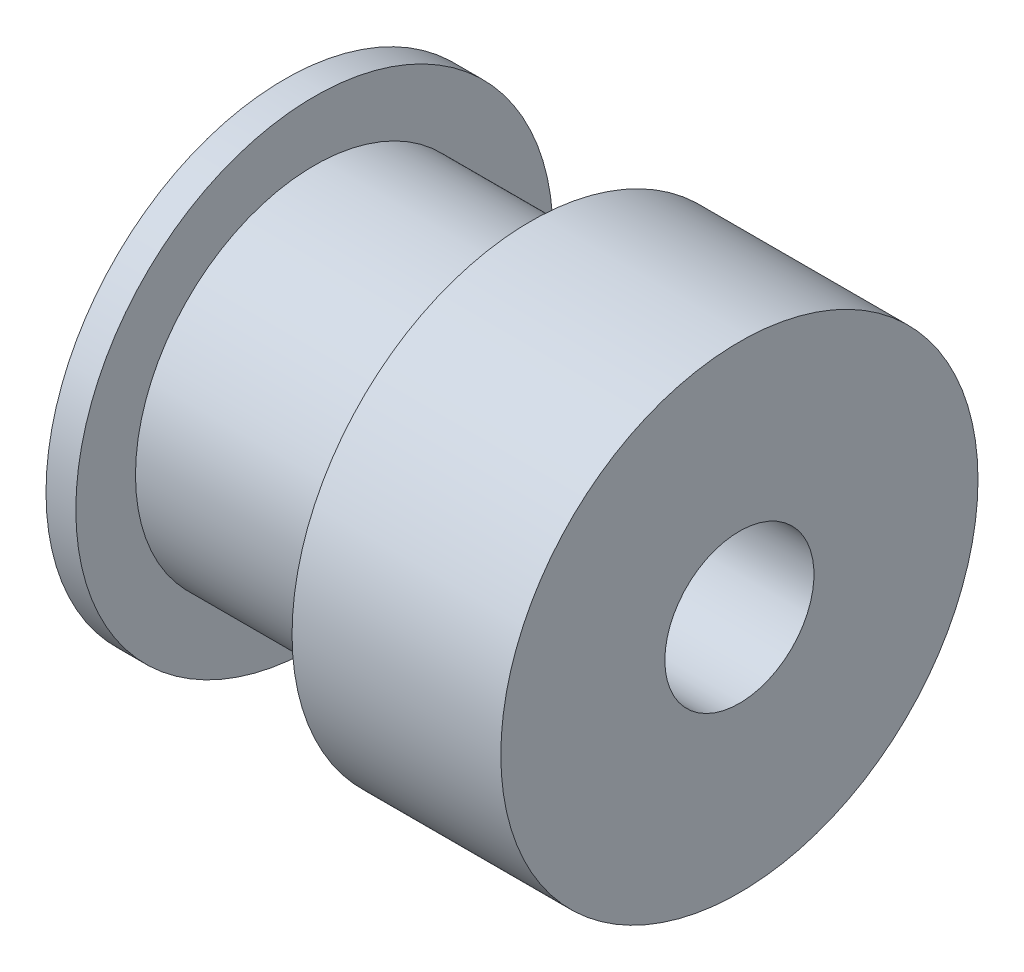
ISO-10303-21;
HEADER;
FILE_DESCRIPTION(('STEP AP214'),'2;1');
FILE_NAME('part.step','',(''),(''),'','','');
FILE_SCHEMA(('AUTOMOTIVE_DESIGN { 1 0 10303 214 1 1 1 1 }'));
ENDSEC;
DATA;
#1=APPLICATION_CONTEXT('core data for automotive mechanical design processes');
#2=APPLICATION_PROTOCOL_DEFINITION('international standard','automotive_design',2000,#1);
#3=PRODUCT_CONTEXT('',#1,'mechanical');
#4=PRODUCT('Part','Part','',(#3));
#5=PRODUCT_RELATED_PRODUCT_CATEGORY('part','',(#4));
#6=PRODUCT_DEFINITION_FORMATION('','',#4);
#7=PRODUCT_DEFINITION_CONTEXT('part definition',#1,'design');
#8=PRODUCT_DEFINITION('design','',#6,#7);
#9=PRODUCT_DEFINITION_SHAPE('','',#8);
#10=(LENGTH_UNIT() NAMED_UNIT(*) SI_UNIT(.MILLI.,.METRE.));
#11=(NAMED_UNIT(*) PLANE_ANGLE_UNIT() SI_UNIT($,.RADIAN.));
#12=(NAMED_UNIT(*) SI_UNIT($,.STERADIAN.) SOLID_ANGLE_UNIT());
#13=UNCERTAINTY_MEASURE_WITH_UNIT(LENGTH_MEASURE(1.E-05),#10,'distance_accuracy_value','');
#14=(GEOMETRIC_REPRESENTATION_CONTEXT(3) GLOBAL_UNCERTAINTY_ASSIGNED_CONTEXT((#13)) GLOBAL_UNIT_ASSIGNED_CONTEXT((#10,
#11,#12)) REPRESENTATION_CONTEXT('',''));
#15=CARTESIAN_POINT('',(0.,0.,0.));
#16=DIRECTION('',(0.,0.,1.));
#17=DIRECTION('',(1.,0.,0.));
#18=AXIS2_PLACEMENT_3D('',#15,#16,#17);
#19=CARTESIAN_POINT('',(-7.625,2.5,0.));
#20=DIRECTION('',(1.,0.,0.));
#21=DIRECTION('',(0.,0.,-1.));
#22=AXIS2_PLACEMENT_3D('',#19,#20,#21);
#23=PLANE('',#22);
#24=CARTESIAN_POINT('',(-7.625,0.,0.));
#25=DIRECTION('',(-1.,0.,0.));
#26=DIRECTION('',(0.,0.,1.));
#27=AXIS2_PLACEMENT_3D('',#24,#25,#26);
#28=CIRCLE('',#27,2.5);
#29=CARTESIAN_POINT('',(-7.625,0.,2.5));
#30=VERTEX_POINT('',#29);
#31=EDGE_CURVE('E63',#30,#30,#28,.T.);
#32=ORIENTED_EDGE('',*,*,#31,.F.);
#33=EDGE_LOOP('',(#32));
#34=FACE_BOUND('',#33,.T.);
#35=CARTESIAN_POINT('',(-7.625,0.,0.));
#36=DIRECTION('',(-1.,0.,0.));
#37=DIRECTION('',(0.,0.,1.));
#38=AXIS2_PLACEMENT_3D('',#35,#36,#37);
#39=CIRCLE('',#38,8.);
#40=CARTESIAN_POINT('',(-7.625,0.,8.));
#41=VERTEX_POINT('',#40);
#42=EDGE_CURVE('E10',#41,#41,#39,.T.);
#43=ORIENTED_EDGE('',*,*,#42,.T.);
#44=EDGE_LOOP('',(#43));
#45=FACE_BOUND('',#44,.T.);
#46=ADVANCED_FACE('F35',(#34,#45),#23,.F.);
#47=CARTESIAN_POINT('',(-7.625,0.,0.));
#48=DIRECTION('',(-1.,0.,0.));
#49=DIRECTION('',(0.,0.,1.));
#50=AXIS2_PLACEMENT_3D('',#47,#48,#49);
#51=CYLINDRICAL_SURFACE('',#50,8.);
#52=ORIENTED_EDGE('',*,*,#42,.F.);
#53=EDGE_LOOP('',(#52));
#54=FACE_BOUND('',#53,.T.);
#55=CARTESIAN_POINT('',(-6.625,0.,0.));
#56=DIRECTION('',(-1.,0.,0.));
#57=DIRECTION('',(0.,0.,1.));
#58=AXIS2_PLACEMENT_3D('',#55,#56,#57);
#59=CIRCLE('',#58,8.);
#60=CARTESIAN_POINT('',(-6.625,0.,8.));
#61=VERTEX_POINT('',#60);
#62=EDGE_CURVE('E41',#61,#61,#59,.T.);
#63=ORIENTED_EDGE('',*,*,#62,.T.);
#64=EDGE_LOOP('',(#63));
#65=FACE_BOUND('',#64,.T.);
#66=ADVANCED_FACE('F70',(#54,#65),#51,.T.);
#67=CARTESIAN_POINT('',(-6.625,8.,0.));
#68=DIRECTION('',(-1.,0.,0.));
#69=DIRECTION('',(0.,0.,1.));
#70=AXIS2_PLACEMENT_3D('',#67,#68,#69);
#71=PLANE('',#70);
#72=ORIENTED_EDGE('',*,*,#62,.F.);
#73=EDGE_LOOP('',(#72));
#74=FACE_BOUND('',#73,.T.);
#75=CARTESIAN_POINT('',(-6.625,0.,0.));
#76=DIRECTION('',(-1.,0.,0.));
#77=DIRECTION('',(0.,0.,1.));
#78=AXIS2_PLACEMENT_3D('',#75,#76,#77);
#79=CIRCLE('',#78,6.);
#80=CARTESIAN_POINT('',(-6.625,0.,6.));
#81=VERTEX_POINT('',#80);
#82=EDGE_CURVE('E45',#81,#81,#79,.T.);
#83=ORIENTED_EDGE('',*,*,#82,.T.);
#84=EDGE_LOOP('',(#83));
#85=FACE_BOUND('',#84,.T.);
#86=ADVANCED_FACE('F74',(#74,#85),#71,.F.);
#87=CARTESIAN_POINT('',(-7.625,0.,0.));
#88=DIRECTION('',(-1.,0.,0.));
#89=DIRECTION('',(0.,0.,1.));
#90=AXIS2_PLACEMENT_3D('',#87,#88,#89);
#91=CYLINDRICAL_SURFACE('',#90,6.);
#92=ORIENTED_EDGE('',*,*,#82,.F.);
#93=EDGE_LOOP('',(#92));
#94=FACE_BOUND('',#93,.T.);
#95=CARTESIAN_POINT('',(0.625000000000001,0.,0.));
#96=DIRECTION('',(-1.,0.,0.));
#97=DIRECTION('',(0.,0.,1.));
#98=AXIS2_PLACEMENT_3D('',#95,#96,#97);
#99=CIRCLE('',#98,6.);
#100=CARTESIAN_POINT('',(0.625000000000001,0.,6.));
#101=VERTEX_POINT('',#100);
#102=EDGE_CURVE('E49',#101,#101,#99,.T.);
#103=ORIENTED_EDGE('',*,*,#102,.T.);
#104=EDGE_LOOP('',(#103));
#105=FACE_BOUND('',#104,.T.);
#106=ADVANCED_FACE('F79',(#94,#105),#91,.T.);
#107=CARTESIAN_POINT('',(0.625,6.,0.));
#108=DIRECTION('',(1.,0.,0.));
#109=DIRECTION('',(0.,0.,-1.));
#110=AXIS2_PLACEMENT_3D('',#107,#108,#109);
#111=PLANE('',#110);
#112=ORIENTED_EDGE('',*,*,#102,.F.);
#113=EDGE_LOOP('',(#112));
#114=FACE_BOUND('',#113,.T.);
#115=CARTESIAN_POINT('',(0.625000000000001,0.,0.));
#116=DIRECTION('',(-1.,0.,0.));
#117=DIRECTION('',(0.,0.,1.));
#118=AXIS2_PLACEMENT_3D('',#115,#116,#117);
#119=CIRCLE('',#118,8.);
#120=CARTESIAN_POINT('',(0.625000000000001,0.,8.));
#121=VERTEX_POINT('',#120);
#122=EDGE_CURVE('E54',#121,#121,#119,.T.);
#123=ORIENTED_EDGE('',*,*,#122,.T.);
#124=EDGE_LOOP('',(#123));
#125=FACE_BOUND('',#124,.T.);
#126=ADVANCED_FACE('F85',(#114,#125),#111,.F.);
#127=CARTESIAN_POINT('',(-7.625,0.,0.));
#128=DIRECTION('',(-1.,0.,0.));
#129=DIRECTION('',(0.,0.,1.));
#130=AXIS2_PLACEMENT_3D('',#127,#128,#129);
#131=CYLINDRICAL_SURFACE('',#130,8.);
#132=ORIENTED_EDGE('',*,*,#122,.F.);
#133=EDGE_LOOP('',(#132));
#134=FACE_BOUND('',#133,.T.);
#135=CARTESIAN_POINT('',(7.625,0.,0.));
#136=DIRECTION('',(-1.,0.,0.));
#137=DIRECTION('',(0.,0.,1.));
#138=AXIS2_PLACEMENT_3D('',#135,#136,#137);
#139=CIRCLE('',#138,8.);
#140=CARTESIAN_POINT('',(7.625,0.,8.));
#141=VERTEX_POINT('',#140);
#142=EDGE_CURVE('E57',#141,#141,#139,.T.);
#143=ORIENTED_EDGE('',*,*,#142,.T.);
#144=EDGE_LOOP('',(#143));
#145=FACE_BOUND('',#144,.T.);
#146=ADVANCED_FACE('F89',(#134,#145),#131,.T.);
#147=CARTESIAN_POINT('',(7.625,8.,0.));
#148=DIRECTION('',(-1.,0.,0.));
#149=DIRECTION('',(0.,0.,1.));
#150=AXIS2_PLACEMENT_3D('',#147,#148,#149);
#151=PLANE('',#150);
#152=ORIENTED_EDGE('',*,*,#142,.F.);
#153=EDGE_LOOP('',(#152));
#154=FACE_BOUND('',#153,.T.);
#155=CARTESIAN_POINT('',(7.625,0.,0.));
#156=DIRECTION('',(-1.,0.,0.));
#157=DIRECTION('',(0.,0.,1.));
#158=AXIS2_PLACEMENT_3D('',#155,#156,#157);
#159=CIRCLE('',#158,2.5);
#160=CARTESIAN_POINT('',(7.625,0.,2.5));
#161=VERTEX_POINT('',#160);
#162=EDGE_CURVE('E60',#161,#161,#159,.T.);
#163=ORIENTED_EDGE('',*,*,#162,.T.);
#164=EDGE_LOOP('',(#163));
#165=FACE_BOUND('',#164,.T.);
#166=ADVANCED_FACE('F93',(#154,#165),#151,.F.);
#167=CARTESIAN_POINT('',(-7.625,0.,0.));
#168=DIRECTION('',(-1.,0.,0.));
#169=DIRECTION('',(0.,0.,1.));
#170=AXIS2_PLACEMENT_3D('',#167,#168,#169);
#171=CYLINDRICAL_SURFACE('',#170,2.5);
#172=ORIENTED_EDGE('',*,*,#162,.F.);
#173=EDGE_LOOP('',(#172));
#174=FACE_BOUND('',#173,.T.);
#175=ORIENTED_EDGE('',*,*,#31,.T.);
#176=EDGE_LOOP('',(#175));
#177=FACE_BOUND('',#176,.T.);
#178=ADVANCED_FACE('F67',(#174,#177),#171,.F.);
#179=CLOSED_SHELL('',(#46,#66,#86,#106,#126,#146,#166,#178));
#180=MANIFOLD_SOLID_BREP('B2',#179);
#181=ADVANCED_BREP_SHAPE_REPRESENTATION('',(#18,#180),#14);
#182=SHAPE_DEFINITION_REPRESENTATION(#9,#181);
ENDSEC;
END-ISO-10303-21;
